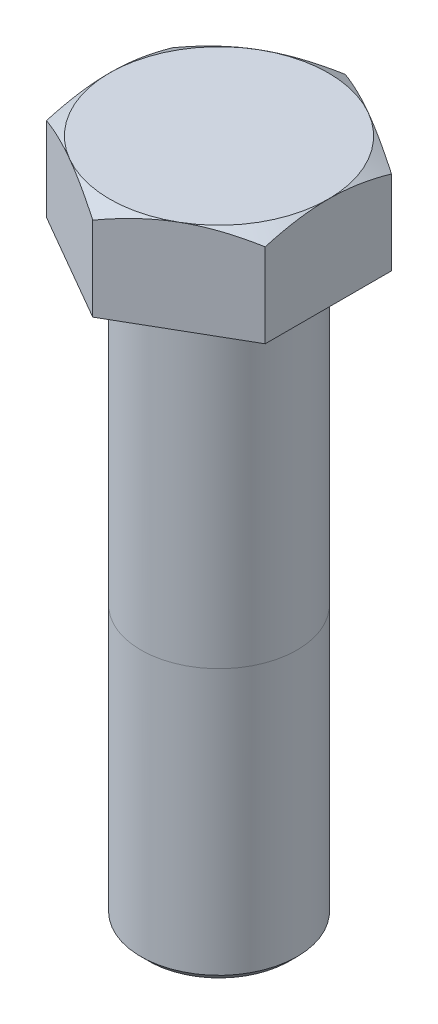
ISO-10303-21;
HEADER;
FILE_DESCRIPTION(('STEP AP214'),'2;1');
FILE_NAME('part.step','',(''),(''),'','','');
FILE_SCHEMA(('AUTOMOTIVE_DESIGN { 1 0 10303 214 1 1 1 1 }'));
ENDSEC;
DATA;
#1=APPLICATION_CONTEXT('core data for automotive mechanical design processes');
#2=APPLICATION_PROTOCOL_DEFINITION('international standard','automotive_design',2000,#1);
#3=PRODUCT_CONTEXT('',#1,'mechanical');
#4=PRODUCT('Part','Part','',(#3));
#5=PRODUCT_RELATED_PRODUCT_CATEGORY('part','',(#4));
#6=PRODUCT_DEFINITION_FORMATION('','',#4);
#7=PRODUCT_DEFINITION_CONTEXT('part definition',#1,'design');
#8=PRODUCT_DEFINITION('design','',#6,#7);
#9=PRODUCT_DEFINITION_SHAPE('','',#8);
#10=(LENGTH_UNIT() NAMED_UNIT(*) SI_UNIT(.MILLI.,.METRE.));
#11=(NAMED_UNIT(*) PLANE_ANGLE_UNIT() SI_UNIT($,.RADIAN.));
#12=(NAMED_UNIT(*) SI_UNIT($,.STERADIAN.) SOLID_ANGLE_UNIT());
#13=UNCERTAINTY_MEASURE_WITH_UNIT(LENGTH_MEASURE(1.E-05),#10,'distance_accuracy_value','');
#14=(GEOMETRIC_REPRESENTATION_CONTEXT(3) GLOBAL_UNCERTAINTY_ASSIGNED_CONTEXT((#13)) GLOBAL_UNIT_ASSIGNED_CONTEXT((#10,
#11,#12)) REPRESENTATION_CONTEXT('',''));
#15=CARTESIAN_POINT('',(0.,0.,0.));
#16=DIRECTION('',(0.,0.,1.));
#17=DIRECTION('',(1.,0.,0.));
#18=AXIS2_PLACEMENT_3D('',#15,#16,#17);
#19=CARTESIAN_POINT('',(0.,-75.,0.));
#20=DIRECTION('',(0.,1.,0.));
#21=DIRECTION('',(0.,0.,1.));
#22=AXIS2_PLACEMENT_3D('',#19,#20,#21);
#23=CYLINDRICAL_SURFACE('',#22,10.);
#24=CARTESIAN_POINT('',(0.,-74.,0.));
#25=DIRECTION('',(0.,-1.,0.));
#26=DIRECTION('',(0.,0.,-1.));
#27=AXIS2_PLACEMENT_3D('',#24,#25,#26);
#28=CIRCLE('',#27,10.);
#29=CARTESIAN_POINT('',(0.,-74.,-10.));
#30=VERTEX_POINT('',#29);
#31=EDGE_CURVE('E242',#30,#30,#28,.F.);
#32=ORIENTED_EDGE('',*,*,#31,.T.);
#33=EDGE_LOOP('',(#32));
#34=FACE_BOUND('',#33,.T.);
#35=CARTESIAN_POINT('',(0.,-40.,0.));
#36=DIRECTION('',(0.,1.,0.));
#37=DIRECTION('',(0.,0.,1.));
#38=AXIS2_PLACEMENT_3D('',#35,#36,#37);
#39=CIRCLE('',#38,10.);
#40=CARTESIAN_POINT('',(10.,-40.,0.));
#41=VERTEX_POINT('',#40);
#42=CARTESIAN_POINT('',(-10.,-40.,0.));
#43=VERTEX_POINT('',#42);
#44=EDGE_CURVE('E12',#41,#43,#39,.T.);
#45=ORIENTED_EDGE('',*,*,#44,.F.);
#46=EDGE_CURVE('E48',#43,#41,#39,.T.);
#47=ORIENTED_EDGE('',*,*,#46,.F.);
#48=EDGE_LOOP('',(#45,#47));
#49=FACE_BOUND('',#48,.T.);
#50=ADVANCED_FACE('F43',(#34,#49),#23,.T.);
#51=CARTESIAN_POINT('',(14.,12.,-8.08290376865477));
#52=DIRECTION('',(-0.5,0.,0.866025403784439));
#53=DIRECTION('',(0.866025403784439,0.,0.5));
#54=AXIS2_PLACEMENT_3D('',#51,#52,#53);
#55=PLANE('',#54);
#56=CARTESIAN_POINT('',(14.0002,10.7495037679405,-8.08278829860093));
#57=CARTESIAN_POINT('',(13.6924853904181,10.8520687355185,-8.26044741127664));
#58=CARTESIAN_POINT('',(13.3835705284393,10.9499795109551,-8.43879948999677));
#59=CARTESIAN_POINT('',(12.7632636692859,11.1351989694353,-8.79693382210912));
#60=CARTESIAN_POINT('',(12.4518708930622,11.2225041654761,-8.97671652528558));
#61=CARTESIAN_POINT('',(11.8260063991707,11.3853389062415,-9.33805955931009));
#62=CARTESIAN_POINT('',(11.5115292047329,11.4608405894043,-9.51962305217277));
#63=CARTESIAN_POINT('',(10.8803895759989,11.5984470625897,-9.88401168671855));
#64=CARTESIAN_POINT('',(10.5637272674325,11.6605526168897,-10.0668367558116));
#65=CARTESIAN_POINT('',(9.93633151674919,11.7687252680104,-10.429063861357));
#66=CARTESIAN_POINT('',(9.62564465325543,11.8151503964399,-10.6084390056288));
#67=CARTESIAN_POINT('',(9.00284729327514,11.8929951265451,-10.968011229064));
#68=CARTESIAN_POINT('',(8.69073676950318,11.9244144393938,-11.1482083239807));
#69=CARTESIAN_POINT('',(8.06599141476664,11.9714542186344,-11.5089052227128));
#70=CARTESIAN_POINT('',(7.75335765114504,11.9870934589966,-11.6894044102975));
#71=CARTESIAN_POINT('',(7.12780152662097,12.0022367596143,-12.0505694071847));
#72=CARTESIAN_POINT('',(6.81487917493454,12.0017413184259,-12.2312352111663));
#73=CARTESIAN_POINT('',(6.22987230119104,11.9857422399056,-12.5689890871999));
#74=CARTESIAN_POINT('',(5.95774609067865,11.9721901053227,-12.7261012280928));
#75=CARTESIAN_POINT('',(5.4141196223319,11.9331392398875,-13.0399641159314));
#76=CARTESIAN_POINT('',(5.14261941013852,11.9076396640127,-13.1967148365263));
#77=CARTESIAN_POINT('',(4.60039240839668,11.8451385190432,-13.5097697419438));
#78=CARTESIAN_POINT('',(4.32966644468922,11.8081274502385,-13.6660734499669));
#79=CARTESIAN_POINT('',(3.78948373337593,11.7232526731859,-13.9779480837552));
#80=CARTESIAN_POINT('',(3.52002707332628,11.6753882271492,-14.1335189589698));
#81=CARTESIAN_POINT('',(2.70207638818785,11.514304872236,-14.6057630072183));
#82=CARTESIAN_POINT('',(2.15595101855753,11.3850242516312,-14.9210686363857));
#83=CARTESIAN_POINT('',(1.07184369066131,11.0916100987946,-15.546978293977));
#84=CARTESIAN_POINT('',(0.53384785211266,10.9275454762133,-15.857590336186));
#85=CARTESIAN_POINT('',(-0.000199999999995857,10.7495037679405,-16.1659230073634));
#86=B_SPLINE_CURVE_WITH_KNOTS('',3,(#56,#57,#58,#59,#60,#61,#62,#63,#64,#65,#66,#67,#68,#69,#70,
#71,#72,#73,#74,#75,#76,#77,#78,#79,#80,#81,#82,#83,#84,#85),.UNSPECIFIED.,.F.,.F.,(4,2,2,2,2,2,
2,2,2,2,2,2,2,2,4),(0.,1.10950436744395,2.21937254652007,3.33182219257025,4.44420835421649,
5.52913815688045,6.6140888410734,7.69774720328185,8.78137208085321,9.72469383358152,
10.6680823159394,11.6122513923123,12.5564846704803,14.4864746839191,16.412676387916),.UNSPECIFIED.);
#87=CARTESIAN_POINT('',(14.,10.7495704353215,-8.08290376865481));
#88=VERTEX_POINT('',#87);
#89=CARTESIAN_POINT('',(7.00000000000001,12.,-12.1243556529822));
#90=VERTEX_POINT('',#89);
#91=EDGE_CURVE('E117',#88,#90,#86,.T.);
#92=ORIENTED_EDGE('',*,*,#91,.F.);
#93=DIRECTION('',(0.,-1.,0.));
#94=VECTOR('',#93,1.);
#95=CARTESIAN_POINT('',(14.,12.,-8.08290376865477));
#96=LINE('',#95,#94);
#97=CARTESIAN_POINT('',(14.,0.,-8.08290376865477));
#98=VERTEX_POINT('',#97);
#99=EDGE_CURVE('E277',#88,#98,#96,.T.);
#100=ORIENTED_EDGE('',*,*,#99,.T.);
#101=DIRECTION('',(-0.866025403784439,0.,-0.5));
#102=VECTOR('',#101,1.);
#103=CARTESIAN_POINT('',(14.,0.,-8.08290376865477));
#104=LINE('',#103,#102);
#105=CARTESIAN_POINT('',(0.,0.,-16.1658075373095));
#106=VERTEX_POINT('',#105);
#107=EDGE_CURVE('E128',#98,#106,#104,.T.);
#108=ORIENTED_EDGE('',*,*,#107,.T.);
#109=DIRECTION('',(0.,-1.,0.));
#110=VECTOR('',#109,1.);
#111=CARTESIAN_POINT('',(0.,12.,-16.1658075373095));
#112=LINE('',#111,#110);
#113=CARTESIAN_POINT('',(0.,10.7495704353214,-16.1658075373095));
#114=VERTEX_POINT('',#113);
#115=EDGE_CURVE('E151',#114,#106,#112,.T.);
#116=ORIENTED_EDGE('',*,*,#115,.F.);
#117=EDGE_CURVE('E129',#90,#114,#86,.T.);
#118=ORIENTED_EDGE('',*,*,#117,.F.);
#119=EDGE_LOOP('',(#92,#100,#108,#116,#118));
#120=FACE_BOUND('',#119,.T.);
#121=ADVANCED_FACE('F149',(#120),#55,.F.);
#122=CARTESIAN_POINT('',(0.,12.,-16.1658075373095));
#123=DIRECTION('',(0.5,0.,0.866025403784439));
#124=DIRECTION('',(0.866025403784439,0.,-0.5));
#125=AXIS2_PLACEMENT_3D('',#122,#123,#124);
#126=PLANE('',#125);
#127=CARTESIAN_POINT('',(0.000200000000002843,10.7495037679405,-16.1659230073634));
#128=CARTESIAN_POINT('',(-0.307514609581917,10.8520687355185,-15.9882638946877));
#129=CARTESIAN_POINT('',(-0.616429471560716,10.9499795109551,-15.8099118159675));
#130=CARTESIAN_POINT('',(-1.23673633071406,11.1351989694353,-15.4517774838552));
#131=CARTESIAN_POINT('',(-1.54812910693776,11.2225041654761,-15.2719947806787));
#132=CARTESIAN_POINT('',(-2.17399360082929,11.3853389062415,-14.9106517466542));
#133=CARTESIAN_POINT('',(-2.48847079526713,11.4608405894043,-14.7290882537915));
#134=CARTESIAN_POINT('',(-3.11961042400106,11.5984470625897,-14.3646996192458));
#135=CARTESIAN_POINT('',(-3.43627273256746,11.6605526168897,-14.1818745501527));
#136=CARTESIAN_POINT('',(-4.06366848325081,11.7687252680104,-13.8196474446073));
#137=CARTESIAN_POINT('',(-4.37435534674458,11.8151503964399,-13.6402723003355));
#138=CARTESIAN_POINT('',(-4.99715270672487,11.8929951265451,-13.2807000769003));
#139=CARTESIAN_POINT('',(-5.30926323049683,11.9244144393938,-13.1005029819836));
#140=CARTESIAN_POINT('',(-5.93400858523337,11.9714542186344,-12.7398060832515));
#141=CARTESIAN_POINT('',(-6.24664234885497,11.9870934589966,-12.5593068956668));
#142=CARTESIAN_POINT('',(-6.87219847337904,12.0022367596143,-12.1981418987796));
#143=CARTESIAN_POINT('',(-7.18512082506547,12.0017413184259,-12.017476094798));
#144=CARTESIAN_POINT('',(-7.77012769880897,11.9857422399056,-11.6797222187644));
#145=CARTESIAN_POINT('',(-8.04225390932136,11.9721901053227,-11.5226100778715));
#146=CARTESIAN_POINT('',(-8.58588037766811,11.9331392398875,-11.2087471900329));
#147=CARTESIAN_POINT('',(-8.85738058986149,11.9076396640127,-11.051996469438));
#148=CARTESIAN_POINT('',(-9.39960759160333,11.8451385190432,-10.7389415640205));
#149=CARTESIAN_POINT('',(-9.67033355531079,11.8081274502385,-10.5826378559974));
#150=CARTESIAN_POINT('',(-10.2105162666241,11.7232526731859,-10.2707632222091));
#151=CARTESIAN_POINT('',(-10.4799729266737,11.6753882271492,-10.1151923469945));
#152=CARTESIAN_POINT('',(-11.2979236118122,11.514304872236,-9.64294829874596));
#153=CARTESIAN_POINT('',(-11.8440489814425,11.3850242516312,-9.32764266957861));
#154=CARTESIAN_POINT('',(-12.9281563093387,11.0916100987946,-8.70173301198728));
#155=CARTESIAN_POINT('',(-13.4661521478874,10.9275454762133,-8.39112096977832));
#156=CARTESIAN_POINT('',(-14.0002,10.7495037679405,-8.08278829860093));
#157=B_SPLINE_CURVE_WITH_KNOTS('',3,(#127,#128,#129,#130,#131,#132,#133,#134,#135,#136,#137,
#138,#139,#140,#141,#142,#143,#144,#145,#146,#147,#148,#149,#150,#151,#152,#153,#154,#155,#156),
.UNSPECIFIED.,.F.,.F.,(4,2,2,2,2,2,2,2,2,2,2,2,2,2,4),(0.,1.10950436744395,2.21937254652007,
3.33182219257025,4.44420835421649,5.52913815688045,6.61408884107341,7.69774720328186,
8.78137208085321,9.72469383358152,10.6680823159394,11.6122513923124,12.5564846704803,
14.4864746839191,16.412676387916),.UNSPECIFIED.);
#158=CARTESIAN_POINT('',(-7.00000000000001,12.,-12.1243556529822));
#159=VERTEX_POINT('',#158);
#160=EDGE_CURVE('E136',#114,#159,#157,.T.);
#161=ORIENTED_EDGE('',*,*,#160,.F.);
#162=ORIENTED_EDGE('',*,*,#115,.T.);
#163=DIRECTION('',(-0.866025403784439,0.,0.5));
#164=VECTOR('',#163,1.);
#165=CARTESIAN_POINT('',(0.,0.,-16.1658075373095));
#166=LINE('',#165,#164);
#167=CARTESIAN_POINT('',(-14.,0.,-8.08290376865477));
#168=VERTEX_POINT('',#167);
#169=EDGE_CURVE('E414',#106,#168,#166,.T.);
#170=ORIENTED_EDGE('',*,*,#169,.T.);
#171=DIRECTION('',(0.,-1.,0.));
#172=VECTOR('',#171,1.);
#173=CARTESIAN_POINT('',(-14.,12.,-8.08290376865477));
#174=LINE('',#173,#172);
#175=CARTESIAN_POINT('',(-14.,10.7495704353214,-8.08290376865477));
#176=VERTEX_POINT('',#175);
#177=EDGE_CURVE('E275',#176,#168,#174,.T.);
#178=ORIENTED_EDGE('',*,*,#177,.F.);
#179=EDGE_CURVE('E152',#159,#176,#157,.T.);
#180=ORIENTED_EDGE('',*,*,#179,.F.);
#181=EDGE_LOOP('',(#161,#162,#170,#178,#180));
#182=FACE_BOUND('',#181,.T.);
#183=ADVANCED_FACE('F214',(#182),#126,.F.);
#184=CARTESIAN_POINT('',(-14.,12.,-8.08290376865477));
#185=DIRECTION('',(1.,0.,0.));
#186=DIRECTION('',(0.,0.,-1.));
#187=AXIS2_PLACEMENT_3D('',#184,#185,#186);
#188=PLANE('',#187);
#189=CARTESIAN_POINT('',(-14.,2.03488379712643,-27.9498313890811));
#190=CARTESIAN_POINT('',(-14.,2.37023076111287,-27.3001164004974));
#191=CARTESIAN_POINT('',(-14.,2.70379549218831,-26.6494735941291));
#192=CARTESIAN_POINT('',(-14.,3.36647218065568,-25.3458869305562));
#193=CARTESIAN_POINT('',(-14.,3.69558392686954,-24.6929429660596));
#194=CARTESIAN_POINT('',(-14.,4.34895509189265,-23.3833263693378));
#195=CARTESIAN_POINT('',(-14.,4.6732059344599,-22.7266494511295));
#196=CARTESIAN_POINT('',(-14.,5.31507219467511,-21.4100681833432));
#197=CARTESIAN_POINT('',(-14.,5.63268771517717,-20.7501638839886));
#198=CARTESIAN_POINT('',(-14.,6.27639782623186,-19.391179329361));
#199=CARTESIAN_POINT('',(-14.,6.60204234665205,-18.6918853351432));
#200=CARTESIAN_POINT('',(-14.,7.24172776898743,-17.2879557164244));
#201=CARTESIAN_POINT('',(-14.,7.55576820136402,-16.5833198771625));
#202=CARTESIAN_POINT('',(-14.,8.16867739244114,-15.167908774893));
#203=CARTESIAN_POINT('',(-14.,8.4675542705998,-14.4571370411742));
#204=CARTESIAN_POINT('',(-14.,9.04570148645687,-13.0276643302037));
#205=CARTESIAN_POINT('',(-14.,9.32497372517714,-12.3089641296015));
#206=CARTESIAN_POINT('',(-14.,9.7448279950664,-11.1682733850545));
#207=CARTESIAN_POINT('',(-14.,9.89407430992689,-10.7494723140834));
#208=CARTESIAN_POINT('',(-14.,10.1823750926574,-9.90838165932032));
#209=CARTESIAN_POINT('',(-14.,10.3214300364788,-9.48609223946529));
#210=CARTESIAN_POINT('',(-14.,10.5875993619507,-8.63766324499775));
#211=CARTESIAN_POINT('',(-14.,10.7147115244666,-8.21152297090499));
#212=CARTESIAN_POINT('',(-14.,10.9549202016765,-7.35528655812802));
#213=CARTESIAN_POINT('',(-14.,11.0680167434794,-6.92519042709697));
#214=CARTESIAN_POINT('',(-14.,11.2758840721237,-6.06946764015134));
#215=CARTESIAN_POINT('',(-14.,11.3709699599945,-5.6439180415987));
#216=CARTESIAN_POINT('',(-14.,11.5432633944381,-4.78922316200009));
#217=CARTESIAN_POINT('',(-14.,11.6204724976302,-4.36007819739462));
#218=CARTESIAN_POINT('',(-14.,11.754837881857,-3.49882659547707));
#219=CARTESIAN_POINT('',(-14.,11.8120030992673,-3.06672136580305));
#220=CARTESIAN_POINT('',(-14.,11.9044878213308,-2.20016115354936));
#221=CARTESIAN_POINT('',(-14.,11.939807634267,-1.76570620421629));
#222=CARTESIAN_POINT('',(-14.,11.9876825524609,-0.889268007055271));
#223=CARTESIAN_POINT('',(-14.,11.9999034228828,-0.44726625212355));
#224=CARTESIAN_POINT('',(-14.,12.0000954352863,0.436742387197305));
#225=CARTESIAN_POINT('',(-14.,11.9880665525097,0.878749271591215));
#226=CARTESIAN_POINT('',(-14.,11.940219694343,1.76157137210901));
#227=CARTESIAN_POINT('',(-14.,11.9043956669625,2.20238625641703));
#228=CARTESIAN_POINT('',(-14.,11.810267664243,3.08159302766076));
#229=CARTESIAN_POINT('',(-14.,11.7519631323143,3.51998485433194));
#230=CARTESIAN_POINT('',(-14.,11.6134038217897,4.40241931971308));
#231=CARTESIAN_POINT('',(-14.,11.5327256319502,4.84639486245936));
#232=CARTESIAN_POINT('',(-14.,11.3523584685403,5.73047648575372));
#233=CARTESIAN_POINT('',(-14.,11.2526676610607,6.17058218873931));
#234=CARTESIAN_POINT('',(-14.,11.0367258826044,7.046775034194));
#235=CARTESIAN_POINT('',(-14.,10.9204716039982,7.48286135545225));
#236=CARTESIAN_POINT('',(-14.,10.6737593179844,8.35097500652423));
#237=CARTESIAN_POINT('',(-14.,10.5433012422703,8.78300231680721));
#238=CARTESIAN_POINT('',(-14.,10.2734644154145,9.63319530104947));
#239=CARTESIAN_POINT('',(-14.,10.1343636924935,10.0514496779824));
#240=CARTESIAN_POINT('',(-14.,9.84632731004816,10.8845668621142));
#241=CARTESIAN_POINT('',(-14.,9.69739119741875,11.2994295120695));
#242=CARTESIAN_POINT('',(-14.,9.39112136186719,12.1261353881979));
#243=CARTESIAN_POINT('',(-14.,9.23378583131534,12.537977942553));
#244=CARTESIAN_POINT('',(-14.,8.91198598962462,13.358854273979));
#245=CARTESIAN_POINT('',(-14.,8.74752178173891,13.7678880916329));
#246=CARTESIAN_POINT('',(-14.,8.41230801263024,14.5839202435863));
#247=CARTESIAN_POINT('',(-14.,8.24155139938857,14.9909156752664));
#248=CARTESIAN_POINT('',(-14.,7.89479563942912,15.8026699480744));
#249=CARTESIAN_POINT('',(-14.,7.71879640672671,16.20742875239));
#250=CARTESIAN_POINT('',(-14.,7.18410896270162,17.4186205811024));
#251=CARTESIAN_POINT('',(-14.,6.81868431848693,18.222081485259));
#252=CARTESIAN_POINT('',(-14.,6.09600771684722,19.7762175122285));
#253=CARTESIAN_POINT('',(-14.,5.73951424702884,20.5272475672054));
#254=CARTESIAN_POINT('',(-14.,5.01722134933971,22.0248444765253));
#255=CARTESIAN_POINT('',(-14.,4.65142159755785,22.7714111743984));
#256=CARTESIAN_POINT('',(-14.,3.9137722793019,24.2583278595973));
#257=CARTESIAN_POINT('',(-14.,3.54194800035149,24.9986904161943));
#258=CARTESIAN_POINT('',(-14.,2.97985081028368,26.1069781380862));
#259=CARTESIAN_POINT('',(-14.,2.79176632306055,26.4760158168577));
#260=CARTESIAN_POINT('',(-14.,2.41427909262906,27.2134142676695));
#261=CARTESIAN_POINT('',(-14.,2.22487635557732,27.581775042861));
#262=CARTESIAN_POINT('',(-14.,2.03488379712644,27.9498313890811));
#263=B_SPLINE_CURVE_WITH_KNOTS('',3,(#189,#190,#191,#192,#193,#194,#195,#196,#197,#198,#199,
#200,#201,#202,#203,#204,#205,#206,#207,#208,#209,#210,#211,#212,#213,#214,#215,#216,#217,#218,
#219,#220,#221,#222,#223,#224,#225,#226,#227,#228,#229,#230,#231,#232,#233,#234,#235,#236,#237,
#238,#239,#240,#241,#242,#243,#244,#245,#246,#247,#248,#249,#250,#251,#252,#253,#254,#255,#256,
#257,#258,#259,#260,#261,#262),.UNSPECIFIED.,.F.,.F.,(4,2,2,2,2,2,2,2,2,2,2,2,2,2,2,2,2,2,2,2,2,
2,2,2,2,2,2,2,2,2,2,2,2,2,2,2,4),(0.,2.19347176186134,4.38704718473206,6.58412117876421,
8.78116109065345,11.0952767189596,13.4094858814932,15.7224425113349,18.035174547799,
19.3688685705576,20.7025002681793,22.0363792850161,23.3702557218224,24.678049280889,
25.9857289211006,27.2928248012449,28.5999022351851,29.9257520686343,31.2516032557345,
32.5777917852944,33.9040131517597,35.2572819955676,36.6106814383634,37.9643515270124,
39.3180281257888,40.6402225516445,41.9624779320169,43.2850190297716,44.6075409779794,
45.9315930896242,47.255666929128,49.9034493909699,52.3974119375353,54.8914614071462,
57.3768884544876,58.619496990037,59.8620997261259),.UNSPECIFIED.);
#264=CARTESIAN_POINT('',(-14.,12.,0.));
#265=VERTEX_POINT('',#264);
#266=EDGE_CURVE('E208',#176,#265,#263,.T.);
#267=ORIENTED_EDGE('',*,*,#266,.F.);
#268=ORIENTED_EDGE('',*,*,#177,.T.);
#269=DIRECTION('',(0.,0.,1.));
#270=VECTOR('',#269,1.);
#271=CARTESIAN_POINT('',(-14.,0.,-8.08290376865477));
#272=LINE('',#271,#270);
#273=CARTESIAN_POINT('',(-14.,0.,8.08290376865476));
#274=VERTEX_POINT('',#273);
#275=EDGE_CURVE('E412',#168,#274,#272,.T.);
#276=ORIENTED_EDGE('',*,*,#275,.T.);
#277=DIRECTION('',(0.,-1.,0.));
#278=VECTOR('',#277,1.);
#279=CARTESIAN_POINT('',(-14.,12.,8.08290376865476));
#280=LINE('',#279,#278);
#281=CARTESIAN_POINT('',(-14.,10.7495704353214,8.08290376865476));
#282=VERTEX_POINT('',#281);
#283=EDGE_CURVE('E272',#282,#274,#280,.T.);
#284=ORIENTED_EDGE('',*,*,#283,.F.);
#285=EDGE_CURVE('E202',#265,#282,#263,.T.);
#286=ORIENTED_EDGE('',*,*,#285,.F.);
#287=EDGE_LOOP('',(#267,#268,#276,#284,#286));
#288=FACE_BOUND('',#287,.T.);
#289=ADVANCED_FACE('F210',(#288),#188,.F.);
#290=CARTESIAN_POINT('',(-14.,12.,8.08290376865476));
#291=DIRECTION('',(0.5,0.,-0.866025403784438));
#292=DIRECTION('',(-0.866025403784439,0.,-0.5));
#293=AXIS2_PLACEMENT_3D('',#290,#291,#292);
#294=PLANE('',#293);
#295=CARTESIAN_POINT('',(-14.0002,10.7495037679405,8.08278829860093));
#296=CARTESIAN_POINT('',(-13.6924853904181,10.8520687355185,8.26044741127663));
#297=CARTESIAN_POINT('',(-13.3835705284393,10.9499795109551,8.43879948999676));
#298=CARTESIAN_POINT('',(-12.7632636692859,11.1351989694353,8.79693382210912));
#299=CARTESIAN_POINT('',(-12.4518708930623,11.2225041654761,8.97671652528557));
#300=CARTESIAN_POINT('',(-11.8260063991707,11.3853389062415,9.33805955931008));
#301=CARTESIAN_POINT('',(-11.5115292047329,11.4608405894043,9.51962305217277));
#302=CARTESIAN_POINT('',(-10.8803895759989,11.5984470625897,9.88401168671854));
#303=CARTESIAN_POINT('',(-10.5637272674326,11.6605526168897,10.0668367558116));
#304=CARTESIAN_POINT('',(-9.93633151674919,11.7687252680104,10.429063861357));
#305=CARTESIAN_POINT('',(-9.62564465325543,11.8151503964399,10.6084390056288));
#306=CARTESIAN_POINT('',(-9.00284729327514,11.8929951265451,10.968011229064));
#307=CARTESIAN_POINT('',(-8.69073676950318,11.9244144393938,11.1482083239807));
#308=CARTESIAN_POINT('',(-8.06599141476664,11.9714542186344,11.5089052227128));
#309=CARTESIAN_POINT('',(-7.75335765114504,11.9870934589966,11.6894044102975));
#310=CARTESIAN_POINT('',(-7.12780152662097,12.0022367596143,12.0505694071847));
#311=CARTESIAN_POINT('',(-6.81487917493454,12.0017413184259,12.2312352111663));
#312=CARTESIAN_POINT('',(-6.22987230119104,11.9857422399056,12.5689890871999));
#313=CARTESIAN_POINT('',(-5.95774609067865,11.9721901053227,12.7261012280928));
#314=CARTESIAN_POINT('',(-5.4141196223319,11.9331392398875,13.0399641159314));
#315=CARTESIAN_POINT('',(-5.14261941013852,11.9076396640127,13.1967148365263));
#316=CARTESIAN_POINT('',(-4.60039240839668,11.8451385190432,13.5097697419438));
#317=CARTESIAN_POINT('',(-4.32966644468922,11.8081274502385,13.6660734499669));
#318=CARTESIAN_POINT('',(-3.78948373337594,11.7232526731859,13.9779480837552));
#319=CARTESIAN_POINT('',(-3.52002707332629,11.6753882271492,14.1335189589698));
#320=CARTESIAN_POINT('',(-2.70207638818785,11.514304872236,14.6057630072183));
#321=CARTESIAN_POINT('',(-2.15595101855753,11.3850242516312,14.9210686363857));
#322=CARTESIAN_POINT('',(-1.07184369066131,11.0916100987946,15.546978293977));
#323=CARTESIAN_POINT('',(-0.533847852112662,10.9275454762133,15.857590336186));
#324=CARTESIAN_POINT('',(0.00019999999999699,10.7495037679405,16.1659230073634));
#325=B_SPLINE_CURVE_WITH_KNOTS('',3,(#295,#296,#297,#298,#299,#300,#301,#302,#303,#304,#305,
#306,#307,#308,#309,#310,#311,#312,#313,#314,#315,#316,#317,#318,#319,#320,#321,#322,#323,#324),
.UNSPECIFIED.,.F.,.F.,(4,2,2,2,2,2,2,2,2,2,2,2,2,2,4),(0.,1.10950436744395,2.21937254652007,
3.33182219257025,4.44420835421649,5.52913815688045,6.6140888410734,7.69774720328186,
8.78137208085321,9.72469383358152,10.6680823159394,11.6122513923123,12.5564846704803,
14.4864746839191,16.412676387916),.UNSPECIFIED.);
#326=CARTESIAN_POINT('',(-7.00000000000001,12.,12.1243556529821));
#327=VERTEX_POINT('',#326);
#328=EDGE_CURVE('E209',#282,#327,#325,.T.);
#329=ORIENTED_EDGE('',*,*,#328,.F.);
#330=ORIENTED_EDGE('',*,*,#283,.T.);
#331=DIRECTION('',(0.866025403784438,0.,0.5));
#332=VECTOR('',#331,1.);
#333=CARTESIAN_POINT('',(-14.,0.,8.08290376865476));
#334=LINE('',#333,#332);
#335=CARTESIAN_POINT('',(0.,0.,16.1658075373095));
#336=VERTEX_POINT('',#335);
#337=EDGE_CURVE('E268',#274,#336,#334,.T.);
#338=ORIENTED_EDGE('',*,*,#337,.T.);
#339=DIRECTION('',(0.,-1.,0.));
#340=VECTOR('',#339,1.);
#341=CARTESIAN_POINT('',(0.,12.,16.1658075373095));
#342=LINE('',#341,#340);
#343=CARTESIAN_POINT('',(0.,10.7495704353214,16.1658075373095));
#344=VERTEX_POINT('',#343);
#345=EDGE_CURVE('E266',#344,#336,#342,.T.);
#346=ORIENTED_EDGE('',*,*,#345,.F.);
#347=EDGE_CURVE('E196',#327,#344,#325,.T.);
#348=ORIENTED_EDGE('',*,*,#347,.F.);
#349=EDGE_LOOP('',(#329,#330,#338,#346,#348));
#350=FACE_BOUND('',#349,.T.);
#351=ADVANCED_FACE('F213',(#350),#294,.F.);
#352=CARTESIAN_POINT('',(0.,12.,16.1658075373095));
#353=DIRECTION('',(-0.5,0.,-0.866025403784439));
#354=DIRECTION('',(-0.866025403784439,0.,0.5));
#355=AXIS2_PLACEMENT_3D('',#352,#353,#354);
#356=PLANE('',#355);
#357=CARTESIAN_POINT('',(-0.00020000000000371,10.7495037679405,16.1659230073634));
#358=CARTESIAN_POINT('',(0.307514609581917,10.8520687355185,15.9882638946877));
#359=CARTESIAN_POINT('',(0.616429471560715,10.9499795109551,15.8099118159675));
#360=CARTESIAN_POINT('',(1.23673633071406,11.1351989694353,15.4517774838552));
#361=CARTESIAN_POINT('',(1.54812910693775,11.2225041654761,15.2719947806787));
#362=CARTESIAN_POINT('',(2.17399360082929,11.3853389062415,14.9106517466542));
#363=CARTESIAN_POINT('',(2.48847079526713,11.4608405894043,14.7290882537915));
#364=CARTESIAN_POINT('',(3.11961042400106,11.5984470625897,14.3646996192458));
#365=CARTESIAN_POINT('',(3.43627273256745,11.6605526168897,14.1818745501527));
#366=CARTESIAN_POINT('',(4.06366848325081,11.7687252680104,13.8196474446073));
#367=CARTESIAN_POINT('',(4.37435534674457,11.8151503964399,13.6402723003355));
#368=CARTESIAN_POINT('',(4.99715270672487,11.8929951265451,13.2807000769003));
#369=CARTESIAN_POINT('',(5.30926323049682,11.9244144393938,13.1005029819836));
#370=CARTESIAN_POINT('',(5.93400858523337,11.9714542186344,12.7398060832515));
#371=CARTESIAN_POINT('',(6.24664234885496,11.9870934589966,12.5593068956668));
#372=CARTESIAN_POINT('',(6.87219847337904,12.0022367596143,12.1981418987796));
#373=CARTESIAN_POINT('',(7.18512082506547,12.0017413184259,12.017476094798));
#374=CARTESIAN_POINT('',(7.77012769880897,11.9857422399056,11.6797222187644));
#375=CARTESIAN_POINT('',(8.04225390932135,11.9721901053227,11.5226100778715));
#376=CARTESIAN_POINT('',(8.58588037766811,11.9331392398875,11.2087471900329));
#377=CARTESIAN_POINT('',(8.85738058986149,11.9076396640127,11.051996469438));
#378=CARTESIAN_POINT('',(9.39960759160333,11.8451385190432,10.7389415640205));
#379=CARTESIAN_POINT('',(9.67033355531079,11.8081274502385,10.5826378559974));
#380=CARTESIAN_POINT('',(10.2105162666241,11.7232526731859,10.2707632222091));
#381=CARTESIAN_POINT('',(10.4799729266737,11.6753882271492,10.1151923469945));
#382=CARTESIAN_POINT('',(11.2979236118122,11.514304872236,9.64294829874595));
#383=CARTESIAN_POINT('',(11.8440489814425,11.3850242516312,9.3276426695786));
#384=CARTESIAN_POINT('',(12.9281563093387,11.0916100987946,8.70173301198727));
#385=CARTESIAN_POINT('',(13.4661521478873,10.9275454762133,8.39112096977831));
#386=CARTESIAN_POINT('',(14.0002,10.7495037679405,8.08278829860093));
#387=B_SPLINE_CURVE_WITH_KNOTS('',3,(#357,#358,#359,#360,#361,#362,#363,#364,#365,#366,#367,
#368,#369,#370,#371,#372,#373,#374,#375,#376,#377,#378,#379,#380,#381,#382,#383,#384,#385,#386),
.UNSPECIFIED.,.F.,.F.,(4,2,2,2,2,2,2,2,2,2,2,2,2,2,4),(0.,1.10950436744395,2.21937254652007,
3.33182219257025,4.44420835421649,5.52913815688045,6.6140888410734,7.69774720328186,
8.78137208085321,9.72469383358152,10.6680823159394,11.6122513923124,12.5564846704803,
14.4864746839191,16.412676387916),.UNSPECIFIED.);
#388=CARTESIAN_POINT('',(7.00000000000001,12.,12.1243556529821));
#389=VERTEX_POINT('',#388);
#390=EDGE_CURVE('E247',#344,#389,#387,.T.);
#391=ORIENTED_EDGE('',*,*,#390,.F.);
#392=ORIENTED_EDGE('',*,*,#345,.T.);
#393=DIRECTION('',(0.866025403784438,0.,-0.5));
#394=VECTOR('',#393,1.);
#395=CARTESIAN_POINT('',(0.,0.,16.1658075373095));
#396=LINE('',#395,#394);
#397=CARTESIAN_POINT('',(14.,0.,8.08290376865476));
#398=VERTEX_POINT('',#397);
#399=EDGE_CURVE('E403',#336,#398,#396,.T.);
#400=ORIENTED_EDGE('',*,*,#399,.T.);
#401=DIRECTION('',(0.,-1.,0.));
#402=VECTOR('',#401,1.);
#403=CARTESIAN_POINT('',(14.,12.,8.08290376865476));
#404=LINE('',#403,#402);
#405=CARTESIAN_POINT('',(14.,10.7495704353214,8.08290376865476));
#406=VERTEX_POINT('',#405);
#407=EDGE_CURVE('E273',#406,#398,#404,.T.);
#408=ORIENTED_EDGE('',*,*,#407,.F.);
#409=EDGE_CURVE('E189',#389,#406,#387,.T.);
#410=ORIENTED_EDGE('',*,*,#409,.F.);
#411=EDGE_LOOP('',(#391,#392,#400,#408,#410));
#412=FACE_BOUND('',#411,.T.);
#413=ADVANCED_FACE('F367',(#412),#356,.F.);
#414=CARTESIAN_POINT('',(14.,12.,8.08290376865476));
#415=DIRECTION('',(-1.,0.,0.));
#416=DIRECTION('',(0.,0.,1.));
#417=AXIS2_PLACEMENT_3D('',#414,#415,#416);
#418=PLANE('',#417);
#419=CARTESIAN_POINT('',(14.,2.03488379712644,27.9498313890811));
#420=CARTESIAN_POINT('',(14.,2.37023076111287,27.3001164004974));
#421=CARTESIAN_POINT('',(14.,2.70379549218831,26.6494735941291));
#422=CARTESIAN_POINT('',(14.,3.36647218065568,25.3458869305562));
#423=CARTESIAN_POINT('',(14.,3.69558392686955,24.6929429660596));
#424=CARTESIAN_POINT('',(14.,4.34895509189265,23.3833263693378));
#425=CARTESIAN_POINT('',(14.,4.6732059344599,22.7266494511295));
#426=CARTESIAN_POINT('',(14.,5.31507219467511,21.4100681833432));
#427=CARTESIAN_POINT('',(14.,5.63268771517717,20.7501638839886));
#428=CARTESIAN_POINT('',(14.,6.27639782623186,19.391179329361));
#429=CARTESIAN_POINT('',(14.,6.60204234665205,18.6918853351432));
#430=CARTESIAN_POINT('',(14.,7.24172776898743,17.2879557164244));
#431=CARTESIAN_POINT('',(14.,7.55576820136403,16.5833198771625));
#432=CARTESIAN_POINT('',(14.,8.16867739244114,15.167908774893));
#433=CARTESIAN_POINT('',(14.,8.4675542705998,14.4571370411742));
#434=CARTESIAN_POINT('',(14.,9.04570148645687,13.0276643302037));
#435=CARTESIAN_POINT('',(14.,9.32497372517714,12.3089641296015));
#436=CARTESIAN_POINT('',(14.,9.7448279950664,11.1682733850545));
#437=CARTESIAN_POINT('',(14.,9.89407430992689,10.7494723140834));
#438=CARTESIAN_POINT('',(14.,10.1823750926574,9.90838165932032));
#439=CARTESIAN_POINT('',(14.,10.3214300364788,9.48609223946529));
#440=CARTESIAN_POINT('',(14.,10.5875993619507,8.63766324499775));
#441=CARTESIAN_POINT('',(14.,10.7147115244666,8.21152297090498));
#442=CARTESIAN_POINT('',(14.,10.9549202016765,7.35528655812802));
#443=CARTESIAN_POINT('',(14.,11.0680167434794,6.92519042709697));
#444=CARTESIAN_POINT('',(14.,11.2758840721237,6.06946764015134));
#445=CARTESIAN_POINT('',(14.,11.3709699599945,5.6439180415987));
#446=CARTESIAN_POINT('',(14.,11.5432633944381,4.78922316200008));
#447=CARTESIAN_POINT('',(14.,11.6204724976302,4.36007819739461));
#448=CARTESIAN_POINT('',(14.,11.754837881857,3.49882659547706));
#449=CARTESIAN_POINT('',(14.,11.8120030992673,3.06672136580304));
#450=CARTESIAN_POINT('',(14.,11.9044878213308,2.20016115354935));
#451=CARTESIAN_POINT('',(14.,11.939807634267,1.76570620421629));
#452=CARTESIAN_POINT('',(14.,11.9876825524609,0.889268007055268));
#453=CARTESIAN_POINT('',(14.,11.9999034228828,0.447266252123547));
#454=CARTESIAN_POINT('',(14.,12.0000954352863,-0.436742387197307));
#455=CARTESIAN_POINT('',(14.,11.9880665525097,-0.878749271591216));
#456=CARTESIAN_POINT('',(14.,11.940219694343,-1.76157137210901));
#457=CARTESIAN_POINT('',(14.,11.9043956669625,-2.20238625641703));
#458=CARTESIAN_POINT('',(14.,11.810267664243,-3.08159302766076));
#459=CARTESIAN_POINT('',(14.,11.7519631323143,-3.51998485433194));
#460=CARTESIAN_POINT('',(14.,11.6134038217897,-4.40241931971308));
#461=CARTESIAN_POINT('',(14.,11.5327256319502,-4.84639486245936));
#462=CARTESIAN_POINT('',(14.,11.3523584685403,-5.73047648575372));
#463=CARTESIAN_POINT('',(14.,11.2526676610607,-6.17058218873932));
#464=CARTESIAN_POINT('',(14.,11.0367258826044,-7.046775034194));
#465=CARTESIAN_POINT('',(14.,10.9204716039982,-7.48286135545225));
#466=CARTESIAN_POINT('',(14.,10.6737593179844,-8.35097500652424));
#467=CARTESIAN_POINT('',(14.,10.5433012422703,-8.78300231680721));
#468=CARTESIAN_POINT('',(14.,10.2734644154145,-9.63319530104947));
#469=CARTESIAN_POINT('',(14.,10.1343636924935,-10.0514496779824));
#470=CARTESIAN_POINT('',(14.,9.84632731004816,-10.8845668621142));
#471=CARTESIAN_POINT('',(14.,9.69739119741875,-11.2994295120695));
#472=CARTESIAN_POINT('',(14.,9.39112136186719,-12.1261353881979));
#473=CARTESIAN_POINT('',(14.,9.23378583131534,-12.537977942553));
#474=CARTESIAN_POINT('',(14.,8.91198598962462,-13.358854273979));
#475=CARTESIAN_POINT('',(14.,8.74752178173891,-13.7678880916329));
#476=CARTESIAN_POINT('',(14.,8.41230801263024,-14.5839202435863));
#477=CARTESIAN_POINT('',(14.,8.24155139938857,-14.9909156752665));
#478=CARTESIAN_POINT('',(14.,7.89479563942913,-15.8026699480744));
#479=CARTESIAN_POINT('',(14.,7.71879640672671,-16.20742875239));
#480=CARTESIAN_POINT('',(14.,7.18410896270162,-17.4186205811024));
#481=CARTESIAN_POINT('',(14.,6.81868431848693,-18.222081485259));
#482=CARTESIAN_POINT('',(14.,6.09600771684722,-19.7762175122285));
#483=CARTESIAN_POINT('',(14.,5.73951424702883,-20.5272475672054));
#484=CARTESIAN_POINT('',(14.,5.0172213493397,-22.0248444765253));
#485=CARTESIAN_POINT('',(14.,4.65142159755785,-22.7714111743984));
#486=CARTESIAN_POINT('',(14.,3.9137722793019,-24.2583278595973));
#487=CARTESIAN_POINT('',(14.,3.54194800035148,-24.9986904161943));
#488=CARTESIAN_POINT('',(14.,2.97985081028367,-26.1069781380862));
#489=CARTESIAN_POINT('',(14.,2.79176632306054,-26.4760158168578));
#490=CARTESIAN_POINT('',(14.,2.41427909262905,-27.2134142676695));
#491=CARTESIAN_POINT('',(14.,2.22487635557731,-27.581775042861));
#492=CARTESIAN_POINT('',(14.,2.03488379712643,-27.9498313890811));
#493=B_SPLINE_CURVE_WITH_KNOTS('',3,(#419,#420,#421,#422,#423,#424,#425,#426,#427,#428,#429,
#430,#431,#432,#433,#434,#435,#436,#437,#438,#439,#440,#441,#442,#443,#444,#445,#446,#447,#448,
#449,#450,#451,#452,#453,#454,#455,#456,#457,#458,#459,#460,#461,#462,#463,#464,#465,#466,#467,
#468,#469,#470,#471,#472,#473,#474,#475,#476,#477,#478,#479,#480,#481,#482,#483,#484,#485,#486,
#487,#488,#489,#490,#491,#492),.UNSPECIFIED.,.F.,.F.,(4,2,2,2,2,2,2,2,2,2,2,2,2,2,2,2,2,2,2,2,2,
2,2,2,2,2,2,2,2,2,2,2,2,2,2,2,4),(0.,2.19347176186133,4.38704718473206,6.58412117876421,
8.78116109065345,11.0952767189596,13.4094858814932,15.7224425113349,18.035174547799,
19.3688685705576,20.7025002681793,22.0363792850161,23.3702557218224,24.678049280889,
25.9857289211006,27.2928248012449,28.5999022351851,29.9257520686343,31.2516032557345,
32.5777917852944,33.9040131517597,35.2572819955676,36.6106814383634,37.9643515270124,
39.3180281257888,40.6402225516445,41.9624779320169,43.2850190297716,44.6075409779794,
45.9315930896242,47.255666929128,49.9034493909699,52.3974119375353,54.8914614071462,
57.3768884544876,58.619496990037,59.8620997261259),.UNSPECIFIED.);
#494=CARTESIAN_POINT('',(14.,12.,0.));
#495=VERTEX_POINT('',#494);
#496=EDGE_CURVE('E244',#406,#495,#493,.T.);
#497=ORIENTED_EDGE('',*,*,#496,.F.);
#498=ORIENTED_EDGE('',*,*,#407,.T.);
#499=DIRECTION('',(0.,0.,-1.));
#500=VECTOR('',#499,1.);
#501=CARTESIAN_POINT('',(14.,0.,8.08290376865476));
#502=LINE('',#501,#500);
#503=EDGE_CURVE('E406',#398,#98,#502,.T.);
#504=ORIENTED_EDGE('',*,*,#503,.T.);
#505=ORIENTED_EDGE('',*,*,#99,.F.);
#506=EDGE_CURVE('E124',#495,#88,#493,.T.);
#507=ORIENTED_EDGE('',*,*,#506,.F.);
#508=EDGE_LOOP('',(#497,#498,#504,#505,#507));
#509=FACE_BOUND('',#508,.T.);
#510=ADVANCED_FACE('F310',(#509),#418,.F.);
#511=CARTESIAN_POINT('',(0.,0.,0.));
#512=DIRECTION('',(0.,1.,0.));
#513=DIRECTION('',(0.,0.,1.));
#514=AXIS2_PLACEMENT_3D('',#511,#512,#513);
#515=PLANE('',#514);
#516=CARTESIAN_POINT('',(0.,0.,0.));
#517=DIRECTION('',(0.,-1.,0.));
#518=DIRECTION('',(0.,0.,-1.));
#519=AXIS2_PLACEMENT_3D('',#516,#517,#518);
#520=CIRCLE('',#519,10.);
#521=CARTESIAN_POINT('',(0.,0.,-10.));
#522=VERTEX_POINT('',#521);
#523=EDGE_CURVE('E146',#522,#522,#520,.T.);
#524=ORIENTED_EDGE('',*,*,#523,.F.);
#525=EDGE_LOOP('',(#524));
#526=FACE_BOUND('',#525,.T.);
#527=ORIENTED_EDGE('',*,*,#107,.F.);
#528=ORIENTED_EDGE('',*,*,#503,.F.);
#529=ORIENTED_EDGE('',*,*,#399,.F.);
#530=ORIENTED_EDGE('',*,*,#337,.F.);
#531=ORIENTED_EDGE('',*,*,#275,.F.);
#532=ORIENTED_EDGE('',*,*,#169,.F.);
#533=EDGE_LOOP('',(#527,#528,#529,#530,#531,#532));
#534=FACE_BOUND('',#533,.T.);
#535=ADVANCED_FACE('F305',(#526,#534),#515,.F.);
#536=CARTESIAN_POINT('',(0.,12.,0.));
#537=DIRECTION('',(0.,-1.,0.));
#538=DIRECTION('',(0.,0.,1.));
#539=AXIS2_PLACEMENT_3D('',#536,#537,#538);
#540=CONICAL_SURFACE('',#539,14.,1.0471975511966);
#541=ORIENTED_EDGE('',*,*,#347,.T.);
#542=ORIENTED_EDGE('',*,*,#390,.T.);
#543=CARTESIAN_POINT('',(0.,12.,0.));
#544=DIRECTION('',(0.,1.,0.));
#545=DIRECTION('',(0.,0.,1.));
#546=AXIS2_PLACEMENT_3D('',#543,#544,#545);
#547=CIRCLE('',#546,14.);
#548=EDGE_CURVE('E147',#327,#389,#547,.T.);
#549=ORIENTED_EDGE('',*,*,#548,.F.);
#550=EDGE_LOOP('',(#541,#542,#549));
#551=FACE_BOUND('',#550,.T.);
#552=ADVANCED_FACE('F263',(#551),#540,.T.);
#553=ORIENTED_EDGE('',*,*,#285,.T.);
#554=ORIENTED_EDGE('',*,*,#328,.T.);
#555=EDGE_CURVE('E259',#265,#327,#547,.T.);
#556=ORIENTED_EDGE('',*,*,#555,.F.);
#557=EDGE_LOOP('',(#553,#554,#556));
#558=FACE_BOUND('',#557,.T.);
#559=ADVANCED_FACE('F257',(#558),#540,.T.);
#560=ORIENTED_EDGE('',*,*,#179,.T.);
#561=ORIENTED_EDGE('',*,*,#266,.T.);
#562=EDGE_CURVE('E141',#159,#265,#547,.T.);
#563=ORIENTED_EDGE('',*,*,#562,.F.);
#564=EDGE_LOOP('',(#560,#561,#563));
#565=FACE_BOUND('',#564,.T.);
#566=ADVANCED_FACE('F339',(#565),#540,.T.);
#567=ORIENTED_EDGE('',*,*,#117,.T.);
#568=ORIENTED_EDGE('',*,*,#160,.T.);
#569=EDGE_CURVE('E133',#90,#159,#547,.T.);
#570=ORIENTED_EDGE('',*,*,#569,.F.);
#571=EDGE_LOOP('',(#567,#568,#570));
#572=FACE_BOUND('',#571,.T.);
#573=ADVANCED_FACE('F134',(#572),#540,.T.);
#574=ORIENTED_EDGE('',*,*,#91,.T.);
#575=EDGE_CURVE('E121',#495,#90,#547,.T.);
#576=ORIENTED_EDGE('',*,*,#575,.F.);
#577=ORIENTED_EDGE('',*,*,#506,.T.);
#578=EDGE_LOOP('',(#574,#576,#577));
#579=FACE_BOUND('',#578,.T.);
#580=ADVANCED_FACE('F119',(#579),#540,.T.);
#581=ORIENTED_EDGE('',*,*,#409,.T.);
#582=ORIENTED_EDGE('',*,*,#496,.T.);
#583=CARTESIAN_POINT('',(0.,12.,0.));
#584=DIRECTION('',(0.,1.,0.));
#585=DIRECTION('',(0.,0.,1.));
#586=AXIS2_PLACEMENT_3D('',#583,#584,#585);
#587=CIRCLE('',#586,14.);
#588=EDGE_CURVE('E145',#389,#495,#587,.T.);
#589=ORIENTED_EDGE('',*,*,#588,.F.);
#590=EDGE_LOOP('',(#581,#582,#589));
#591=FACE_BOUND('',#590,.T.);
#592=ADVANCED_FACE('F172',(#591),#540,.T.);
#593=CARTESIAN_POINT('',(0.,12.,0.));
#594=DIRECTION('',(0.,1.,0.));
#595=DIRECTION('',(0.,0.,1.));
#596=AXIS2_PLACEMENT_3D('',#593,#594,#595);
#597=PLANE('',#596);
#598=ORIENTED_EDGE('',*,*,#548,.T.);
#599=ORIENTED_EDGE('',*,*,#588,.T.);
#600=ORIENTED_EDGE('',*,*,#575,.T.);
#601=ORIENTED_EDGE('',*,*,#569,.T.);
#602=ORIENTED_EDGE('',*,*,#562,.T.);
#603=ORIENTED_EDGE('',*,*,#555,.T.);
#604=EDGE_LOOP('',(#598,#599,#600,#601,#602,#603));
#605=FACE_BOUND('',#604,.T.);
#606=ADVANCED_FACE('F144',(#605),#597,.T.);
#607=ORIENTED_EDGE('',*,*,#46,.T.);
#608=ORIENTED_EDGE('',*,*,#44,.T.);
#609=EDGE_LOOP('',(#607,#608));
#610=FACE_BOUND('',#609,.T.);
#611=ORIENTED_EDGE('',*,*,#523,.T.);
#612=EDGE_LOOP('',(#611));
#613=FACE_BOUND('',#612,.T.);
#614=ADVANCED_FACE('F173',(#610,#613),#23,.T.);
#615=CARTESIAN_POINT('',(0.,-75.,0.));
#616=DIRECTION('',(0.,-1.,0.));
#617=DIRECTION('',(0.,0.,-1.));
#618=AXIS2_PLACEMENT_3D('',#615,#616,#617);
#619=PLANE('',#618);
#620=CARTESIAN_POINT('',(0.,-75.,0.));
#621=DIRECTION('',(0.,-1.,0.));
#622=DIRECTION('',(0.,0.,-1.));
#623=AXIS2_PLACEMENT_3D('',#620,#621,#622);
#624=CIRCLE('',#623,8.99999999999999);
#625=CARTESIAN_POINT('',(0.,-75.,-8.99999999999999));
#626=VERTEX_POINT('',#625);
#627=EDGE_CURVE('E239',#626,#626,#624,.T.);
#628=ORIENTED_EDGE('',*,*,#627,.T.);
#629=EDGE_LOOP('',(#628));
#630=FACE_BOUND('',#629,.T.);
#631=ADVANCED_FACE('F229',(#630),#619,.T.);
#632=CARTESIAN_POINT('',(0.,-75.,0.));
#633=DIRECTION('',(0.,1.,0.));
#634=DIRECTION('',(0.,0.,1.));
#635=AXIS2_PLACEMENT_3D('',#632,#633,#634);
#636=CONICAL_SURFACE('',#635,8.99999999999999,0.785398163397444);
#637=ORIENTED_EDGE('',*,*,#31,.F.);
#638=EDGE_LOOP('',(#637));
#639=FACE_BOUND('',#638,.T.);
#640=ORIENTED_EDGE('',*,*,#627,.F.);
#641=EDGE_LOOP('',(#640));
#642=FACE_BOUND('',#641,.T.);
#643=ADVANCED_FACE('F46',(#639,#642),#636,.T.);
#644=CLOSED_SHELL('',(#50,#121,#183,#289,#351,#413,#510,#535,#552,#559,#566,#573,#580,#592,#606,
#614,#631,#643));
#645=MANIFOLD_SOLID_BREP('B2',#644);
#646=ADVANCED_BREP_SHAPE_REPRESENTATION('',(#18,#645),#14);
#647=SHAPE_DEFINITION_REPRESENTATION(#9,#646);
ENDSEC;
END-ISO-10303-21;
